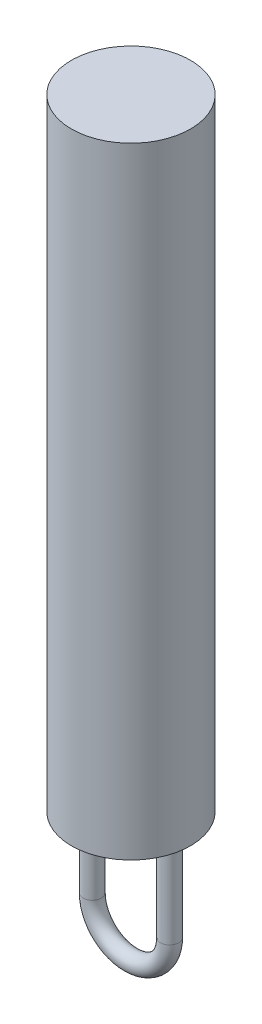
ISO-10303-21;
HEADER;
FILE_DESCRIPTION(('STEP AP214'),'2;1');
FILE_NAME('part.step','',(''),(''),'','','');
FILE_SCHEMA(('AUTOMOTIVE_DESIGN { 1 0 10303 214 1 1 1 1 }'));
ENDSEC;
DATA;
#1=APPLICATION_CONTEXT('core data for automotive mechanical design processes');
#2=APPLICATION_PROTOCOL_DEFINITION('international standard','automotive_design',2000,#1);
#3=PRODUCT_CONTEXT('',#1,'mechanical');
#4=PRODUCT('Part','Part','',(#3));
#5=PRODUCT_RELATED_PRODUCT_CATEGORY('part','',(#4));
#6=PRODUCT_DEFINITION_FORMATION('','',#4);
#7=PRODUCT_DEFINITION_CONTEXT('part definition',#1,'design');
#8=PRODUCT_DEFINITION('design','',#6,#7);
#9=PRODUCT_DEFINITION_SHAPE('','',#8);
#10=(LENGTH_UNIT() NAMED_UNIT(*) SI_UNIT(.MILLI.,.METRE.));
#11=(NAMED_UNIT(*) PLANE_ANGLE_UNIT() SI_UNIT($,.RADIAN.));
#12=(NAMED_UNIT(*) SI_UNIT($,.STERADIAN.) SOLID_ANGLE_UNIT());
#13=UNCERTAINTY_MEASURE_WITH_UNIT(LENGTH_MEASURE(1.E-05),#10,'distance_accuracy_value','');
#14=(GEOMETRIC_REPRESENTATION_CONTEXT(3) GLOBAL_UNCERTAINTY_ASSIGNED_CONTEXT((#13)) GLOBAL_UNIT_ASSIGNED_CONTEXT((#10,
#11,#12)) REPRESENTATION_CONTEXT('',''));
#15=CARTESIAN_POINT('',(0.,0.,0.));
#16=DIRECTION('',(0.,0.,1.));
#17=DIRECTION('',(1.,0.,0.));
#18=AXIS2_PLACEMENT_3D('',#15,#16,#17);
#19=CARTESIAN_POINT('',(0.,0.,0.));
#20=DIRECTION('',(0.,1.,0.));
#21=DIRECTION('',(0.,0.,1.));
#22=AXIS2_PLACEMENT_3D('',#19,#20,#21);
#23=PLANE('',#22);
#24=CARTESIAN_POINT('',(0.,0.,0.));
#25=DIRECTION('',(0.,1.,0.));
#26=DIRECTION('',(0.,0.,1.));
#27=AXIS2_PLACEMENT_3D('',#24,#25,#26);
#28=CIRCLE('',#27,12.7);
#29=CARTESIAN_POINT('',(0.,0.,12.7));
#30=VERTEX_POINT('',#29);
#31=EDGE_CURVE('E43',#30,#30,#28,.T.);
#32=ORIENTED_EDGE('',*,*,#31,.F.);
#33=EDGE_LOOP('',(#32));
#34=FACE_BOUND('',#33,.T.);
#35=CARTESIAN_POINT('',(8.25,0.,0.));
#36=DIRECTION('',(0.,-1.,0.));
#37=DIRECTION('',(0.,0.,-1.));
#38=AXIS2_PLACEMENT_3D('',#35,#36,#37);
#39=CIRCLE('',#38,1.95);
#40=CARTESIAN_POINT('',(8.25,0.,-1.95));
#41=VERTEX_POINT('',#40);
#42=EDGE_CURVE('E10',#41,#41,#39,.T.);
#43=ORIENTED_EDGE('',*,*,#42,.F.);
#44=EDGE_LOOP('',(#43));
#45=FACE_BOUND('',#44,.T.);
#46=CARTESIAN_POINT('',(-8.25,0.,0.));
#47=DIRECTION('',(0.,1.,0.));
#48=DIRECTION('',(0.,0.,-1.));
#49=AXIS2_PLACEMENT_3D('',#46,#47,#48);
#50=CIRCLE('',#49,1.95);
#51=CARTESIAN_POINT('',(-8.25,0.,-1.95));
#52=VERTEX_POINT('',#51);
#53=EDGE_CURVE('E51',#52,#52,#50,.T.);
#54=ORIENTED_EDGE('',*,*,#53,.T.);
#55=EDGE_LOOP('',(#54));
#56=FACE_BOUND('',#55,.T.);
#57=ADVANCED_FACE('F31',(#34,#45,#56),#23,.F.);
#58=CARTESIAN_POINT('',(0.,168.321024484277,0.));
#59=DIRECTION('',(0.,-1.,0.));
#60=DIRECTION('',(0.,0.,-1.));
#61=AXIS2_PLACEMENT_3D('',#58,#59,#60);
#62=CYLINDRICAL_SURFACE('',#61,12.7);
#63=ORIENTED_EDGE('',*,*,#31,.T.);
#64=EDGE_LOOP('',(#63));
#65=FACE_BOUND('',#64,.T.);
#66=CARTESIAN_POINT('',(0.,132.4,0.));
#67=DIRECTION('',(0.,1.,0.));
#68=DIRECTION('',(0.,0.,1.));
#69=AXIS2_PLACEMENT_3D('',#66,#67,#68);
#70=CIRCLE('',#69,12.7);
#71=CARTESIAN_POINT('',(0.,132.4,12.7));
#72=VERTEX_POINT('',#71);
#73=EDGE_CURVE('E35',#72,#72,#70,.T.);
#74=ORIENTED_EDGE('',*,*,#73,.F.);
#75=EDGE_LOOP('',(#74));
#76=FACE_BOUND('',#75,.T.);
#77=ADVANCED_FACE('F56',(#65,#76),#62,.T.);
#78=CARTESIAN_POINT('',(0.,132.4,0.));
#79=DIRECTION('',(0.,1.,0.));
#80=DIRECTION('',(0.,0.,1.));
#81=AXIS2_PLACEMENT_3D('',#78,#79,#80);
#82=PLANE('',#81);
#83=ORIENTED_EDGE('',*,*,#73,.T.);
#84=EDGE_LOOP('',(#83));
#85=FACE_BOUND('',#84,.T.);
#86=ADVANCED_FACE('F33',(#85),#82,.T.);
#87=CARTESIAN_POINT('',(8.25,0.,0.));
#88=DIRECTION('',(0.,-1.,0.));
#89=DIRECTION('',(1.,0.,0.));
#90=AXIS2_PLACEMENT_3D('',#87,#88,#89);
#91=CYLINDRICAL_SURFACE('',#90,1.95);
#92=CARTESIAN_POINT('',(8.25,-19.15,0.));
#93=DIRECTION('',(0.,-1.,0.));
#94=DIRECTION('',(0.,0.,-1.));
#95=AXIS2_PLACEMENT_3D('',#92,#93,#94);
#96=CIRCLE('',#95,1.95);
#97=CARTESIAN_POINT('',(10.2,-19.15,0.));
#98=VERTEX_POINT('',#97);
#99=EDGE_CURVE('E45',#98,#98,#96,.T.);
#100=ORIENTED_EDGE('',*,*,#99,.F.);
#101=EDGE_LOOP('',(#100));
#102=FACE_BOUND('',#101,.T.);
#103=ORIENTED_EDGE('',*,*,#42,.T.);
#104=EDGE_LOOP('',(#103));
#105=FACE_BOUND('',#104,.T.);
#106=ADVANCED_FACE('F74',(#102,#105),#91,.T.);
#107=CARTESIAN_POINT('',(0.,-19.15,0.));
#108=DIRECTION('',(0.,0.,-1.));
#109=DIRECTION('',(-1.,0.,0.));
#110=AXIS2_PLACEMENT_3D('',#107,#108,#109);
#111=TOROIDAL_SURFACE('',#110,8.25,1.95);
#112=CARTESIAN_POINT('',(-8.25,-19.15,0.));
#113=DIRECTION('',(0.,1.,0.));
#114=DIRECTION('',(0.,0.,-1.));
#115=AXIS2_PLACEMENT_3D('',#112,#113,#114);
#116=CIRCLE('',#115,1.95);
#117=CARTESIAN_POINT('',(-10.2,-19.15,0.));
#118=VERTEX_POINT('',#117);
#119=EDGE_CURVE('E48',#118,#118,#116,.T.);
#120=CARTESIAN_POINT('',(0.,-19.15,0.));
#121=DIRECTION('',(0.,0.,-1.));
#122=DIRECTION('',(-1.,0.,0.));
#123=AXIS2_PLACEMENT_3D('',#120,#121,#122);
#124=CIRCLE('',#123,10.2);
#125=EDGE_CURVE('',#98,#118,#124,.T.);
#126=ORIENTED_EDGE('',*,*,#99,.T.);
#127=ORIENTED_EDGE('',*,*,#119,.F.);
#128=ORIENTED_EDGE('',*,*,#125,.T.);
#129=ORIENTED_EDGE('',*,*,#125,.F.);
#130=EDGE_LOOP('',(#126,#128,#127,#129));
#131=FACE_BOUND('',#130,.T.);
#132=ADVANCED_FACE('F68',(#131),#111,.T.);
#133=CARTESIAN_POINT('',(-8.25,-19.15,0.));
#134=DIRECTION('',(0.,1.,0.));
#135=DIRECTION('',(-1.,0.,0.));
#136=AXIS2_PLACEMENT_3D('',#133,#134,#135);
#137=CYLINDRICAL_SURFACE('',#136,1.95);
#138=ORIENTED_EDGE('',*,*,#53,.F.);
#139=EDGE_LOOP('',(#138));
#140=FACE_BOUND('',#139,.T.);
#141=ORIENTED_EDGE('',*,*,#119,.T.);
#142=EDGE_LOOP('',(#141));
#143=FACE_BOUND('',#142,.T.);
#144=ADVANCED_FACE('F65',(#140,#143),#137,.T.);
#145=CLOSED_SHELL('',(#57,#77,#86,#106,#132,#144));
#146=MANIFOLD_SOLID_BREP('B2',#145);
#147=ADVANCED_BREP_SHAPE_REPRESENTATION('',(#18,#146),#14);
#148=SHAPE_DEFINITION_REPRESENTATION(#9,#147);
ENDSEC;
END-ISO-10303-21;
